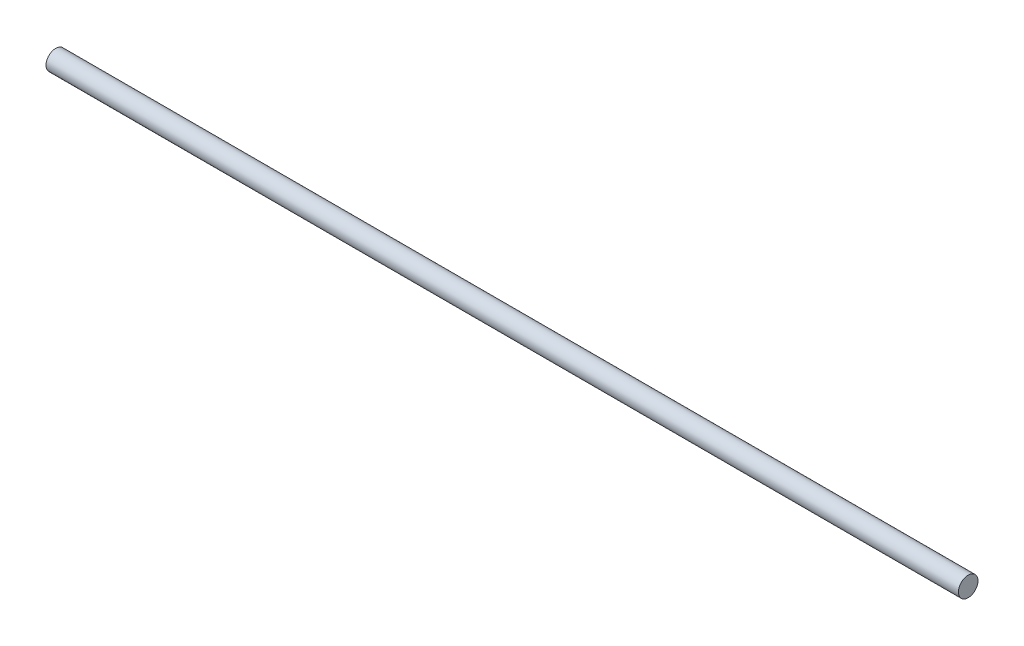
ISO-10303-21;
HEADER;
FILE_DESCRIPTION(('STEP AP214'),'2;1');
FILE_NAME('part.step','',(''),(''),'','','');
FILE_SCHEMA(('AUTOMOTIVE_DESIGN { 1 0 10303 214 1 1 1 1 }'));
ENDSEC;
DATA;
#1=APPLICATION_CONTEXT('core data for automotive mechanical design processes');
#2=APPLICATION_PROTOCOL_DEFINITION('international standard','automotive_design',2000,#1);
#3=PRODUCT_CONTEXT('',#1,'mechanical');
#4=PRODUCT('Part','Part','',(#3));
#5=PRODUCT_RELATED_PRODUCT_CATEGORY('part','',(#4));
#6=PRODUCT_DEFINITION_FORMATION('','',#4);
#7=PRODUCT_DEFINITION_CONTEXT('part definition',#1,'design');
#8=PRODUCT_DEFINITION('design','',#6,#7);
#9=PRODUCT_DEFINITION_SHAPE('','',#8);
#10=(LENGTH_UNIT() NAMED_UNIT(*) SI_UNIT(.MILLI.,.METRE.));
#11=(NAMED_UNIT(*) PLANE_ANGLE_UNIT() SI_UNIT($,.RADIAN.));
#12=(NAMED_UNIT(*) SI_UNIT($,.STERADIAN.) SOLID_ANGLE_UNIT());
#13=UNCERTAINTY_MEASURE_WITH_UNIT(LENGTH_MEASURE(1.E-05),#10,'distance_accuracy_value','');
#14=(GEOMETRIC_REPRESENTATION_CONTEXT(3) GLOBAL_UNCERTAINTY_ASSIGNED_CONTEXT((#13)) GLOBAL_UNIT_ASSIGNED_CONTEXT((#10,
#11,#12)) REPRESENTATION_CONTEXT('',''));
#15=CARTESIAN_POINT('',(0.,0.,0.));
#16=DIRECTION('',(0.,0.,1.));
#17=DIRECTION('',(1.,0.,0.));
#18=AXIS2_PLACEMENT_3D('',#15,#16,#17);
#19=CARTESIAN_POINT('',(373.,0.,0.));
#20=DIRECTION('',(-1.,0.,0.));
#21=DIRECTION('',(0.,0.,1.));
#22=AXIS2_PLACEMENT_3D('',#19,#20,#21);
#23=CYLINDRICAL_SURFACE('',#22,4.);
#24=CARTESIAN_POINT('',(373.,0.,0.));
#25=DIRECTION('',(1.,0.,0.));
#26=DIRECTION('',(0.,0.,-1.));
#27=AXIS2_PLACEMENT_3D('',#24,#25,#26);
#28=CIRCLE('',#27,4.);
#29=CARTESIAN_POINT('',(373.,0.,-4.));
#30=VERTEX_POINT('',#29);
#31=EDGE_CURVE('E10',#30,#30,#28,.T.);
#32=ORIENTED_EDGE('',*,*,#31,.F.);
#33=EDGE_LOOP('',(#32));
#34=FACE_BOUND('',#33,.T.);
#35=CARTESIAN_POINT('',(0.,0.,0.));
#36=DIRECTION('',(1.,0.,0.));
#37=DIRECTION('',(0.,0.,-1.));
#38=AXIS2_PLACEMENT_3D('',#35,#36,#37);
#39=CIRCLE('',#38,4.);
#40=CARTESIAN_POINT('',(0.,0.,-4.));
#41=VERTEX_POINT('',#40);
#42=EDGE_CURVE('E36',#41,#41,#39,.T.);
#43=ORIENTED_EDGE('',*,*,#42,.T.);
#44=EDGE_LOOP('',(#43));
#45=FACE_BOUND('',#44,.T.);
#46=ADVANCED_FACE('F33',(#34,#45),#23,.T.);
#47=CARTESIAN_POINT('',(373.,0.,0.));
#48=DIRECTION('',(1.,0.,0.));
#49=DIRECTION('',(0.,0.,-1.));
#50=AXIS2_PLACEMENT_3D('',#47,#48,#49);
#51=PLANE('',#50);
#52=ORIENTED_EDGE('',*,*,#31,.T.);
#53=EDGE_LOOP('',(#52));
#54=FACE_BOUND('',#53,.T.);
#55=ADVANCED_FACE('F48',(#54),#51,.T.);
#56=CARTESIAN_POINT('',(0.,0.,0.));
#57=DIRECTION('',(1.,0.,0.));
#58=DIRECTION('',(0.,0.,-1.));
#59=AXIS2_PLACEMENT_3D('',#56,#57,#58);
#60=PLANE('',#59);
#61=ORIENTED_EDGE('',*,*,#42,.F.);
#62=EDGE_LOOP('',(#61));
#63=FACE_BOUND('',#62,.T.);
#64=ADVANCED_FACE('F46',(#63),#60,.F.);
#65=CLOSED_SHELL('',(#46,#55,#64));
#66=MANIFOLD_SOLID_BREP('B2',#65);
#67=ADVANCED_BREP_SHAPE_REPRESENTATION('',(#18,#66),#14);
#68=SHAPE_DEFINITION_REPRESENTATION(#9,#67);
ENDSEC;
END-ISO-10303-21;
